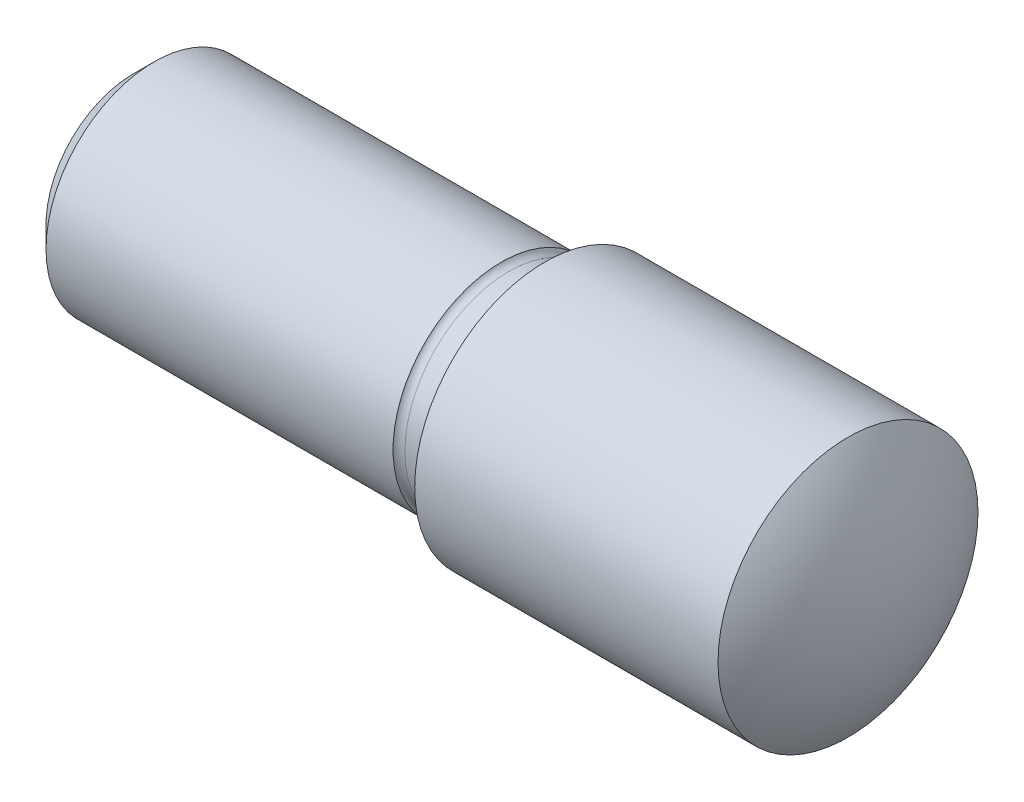
ISO-10303-21;
HEADER;
FILE_DESCRIPTION(('STEP AP214'),'2;1');
FILE_NAME('part.step','',(''),(''),'','','');
FILE_SCHEMA(('AUTOMOTIVE_DESIGN { 1 0 10303 214 1 1 1 1 }'));
ENDSEC;
DATA;
#1=APPLICATION_CONTEXT('core data for automotive mechanical design processes');
#2=APPLICATION_PROTOCOL_DEFINITION('international standard','automotive_design',2000,#1);
#3=PRODUCT_CONTEXT('',#1,'mechanical');
#4=PRODUCT('Part','Part','',(#3));
#5=PRODUCT_RELATED_PRODUCT_CATEGORY('part','',(#4));
#6=PRODUCT_DEFINITION_FORMATION('','',#4);
#7=PRODUCT_DEFINITION_CONTEXT('part definition',#1,'design');
#8=PRODUCT_DEFINITION('design','',#6,#7);
#9=PRODUCT_DEFINITION_SHAPE('','',#8);
#10=(LENGTH_UNIT() NAMED_UNIT(*) SI_UNIT(.MILLI.,.METRE.));
#11=(NAMED_UNIT(*) PLANE_ANGLE_UNIT() SI_UNIT($,.RADIAN.));
#12=(NAMED_UNIT(*) SI_UNIT($,.STERADIAN.) SOLID_ANGLE_UNIT());
#13=UNCERTAINTY_MEASURE_WITH_UNIT(LENGTH_MEASURE(1.E-05),#10,'distance_accuracy_value','');
#14=(GEOMETRIC_REPRESENTATION_CONTEXT(3) GLOBAL_UNCERTAINTY_ASSIGNED_CONTEXT((#13)) GLOBAL_UNIT_ASSIGNED_CONTEXT((#10,
#11,#12)) REPRESENTATION_CONTEXT('',''));
#15=CARTESIAN_POINT('',(0.,0.,0.));
#16=DIRECTION('',(0.,0.,1.));
#17=DIRECTION('',(1.,0.,0.));
#18=AXIS2_PLACEMENT_3D('',#15,#16,#17);
#19=CARTESIAN_POINT('',(-9.5,0.,0.));
#20=DIRECTION('',(1.,0.,0.));
#21=DIRECTION('',(0.,0.,-1.));
#22=AXIS2_PLACEMENT_3D('',#19,#20,#21);
#23=PLANE('',#22);
#24=CARTESIAN_POINT('',(-9.49999999994589,0.,0.));
#25=DIRECTION('',(1.,0.,0.));
#26=DIRECTION('',(0.,0.,-1.));
#27=AXIS2_PLACEMENT_3D('',#24,#25,#26);
#28=CIRCLE('',#27,2.00950000004241);
#29=CARTESIAN_POINT('',(-9.49999999994589,0.,-2.00950000004241));
#30=VERTEX_POINT('',#29);
#31=EDGE_CURVE('E125',#30,#30,#28,.T.);
#32=ORIENTED_EDGE('',*,*,#31,.F.);
#33=EDGE_LOOP('',(#32));
#34=FACE_BOUND('',#33,.T.);
#35=ADVANCED_FACE('F17',(#34),#23,.F.);
#36=CARTESIAN_POINT('',(-9.00950000004741,0.,0.));
#37=DIRECTION('',(1.,0.,0.));
#38=DIRECTION('',(0.,0.,-1.));
#39=AXIS2_PLACEMENT_3D('',#36,#37,#38);
#40=CONICAL_SURFACE('',#39,2.49999999988404,0.785398163339504);
#41=ORIENTED_EDGE('',*,*,#31,.T.);
#42=EDGE_LOOP('',(#41));
#43=FACE_BOUND('',#42,.T.);
#44=CARTESIAN_POINT('',(-9.0095,0.,0.));
#45=DIRECTION('',(-1.,0.,0.));
#46=DIRECTION('',(0.,0.,1.));
#47=AXIS2_PLACEMENT_3D('',#44,#45,#46);
#48=CIRCLE('',#47,2.5);
#49=CARTESIAN_POINT('',(-9.0095,0.,2.5));
#50=VERTEX_POINT('',#49);
#51=EDGE_CURVE('E126',#50,#50,#48,.F.);
#52=ORIENTED_EDGE('',*,*,#51,.F.);
#53=EDGE_LOOP('',(#52));
#54=FACE_BOUND('',#53,.T.);
#55=ADVANCED_FACE('F100',(#43,#54),#40,.T.);
#56=CARTESIAN_POINT('',(0.,0.,0.));
#57=DIRECTION('',(-1.,0.,0.));
#58=DIRECTION('',(0.,0.,1.));
#59=AXIS2_PLACEMENT_3D('',#56,#57,#58);
#60=CYLINDRICAL_SURFACE('',#59,2.5);
#61=CARTESIAN_POINT('',(-1.,0.,0.));
#62=DIRECTION('',(1.,0.,0.));
#63=DIRECTION('',(0.,0.,-1.));
#64=AXIS2_PLACEMENT_3D('',#61,#62,#63);
#65=CIRCLE('',#64,2.5);
#66=CARTESIAN_POINT('',(-1.,0.,-2.5));
#67=VERTEX_POINT('',#66);
#68=EDGE_CURVE('E129',#67,#67,#65,.F.);
#69=ORIENTED_EDGE('',*,*,#68,.T.);
#70=EDGE_LOOP('',(#69));
#71=FACE_BOUND('',#70,.T.);
#72=ORIENTED_EDGE('',*,*,#51,.T.);
#73=EDGE_LOOP('',(#72));
#74=FACE_BOUND('',#73,.T.);
#75=ADVANCED_FACE('F97',(#71,#74),#60,.T.);
#76=CARTESIAN_POINT('',(-0.826794919243111,0.,0.));
#77=DIRECTION('',(1.,0.,0.));
#78=DIRECTION('',(0.,0.,-1.));
#79=AXIS2_PLACEMENT_3D('',#76,#77,#78);
#80=TOROIDAL_SURFACE('',#79,2.6,0.200000000000002);
#81=CARTESIAN_POINT('',(-0.826794919243111,0.,0.));
#82=DIRECTION('',(-1.,0.,0.));
#83=DIRECTION('',(0.,0.,1.));
#84=AXIS2_PLACEMENT_3D('',#81,#82,#83);
#85=CIRCLE('',#84,2.4);
#86=CARTESIAN_POINT('',(-0.826794919243111,0.,2.4));
#87=VERTEX_POINT('',#86);
#88=EDGE_CURVE('E90',#87,#87,#85,.F.);
#89=ORIENTED_EDGE('',*,*,#88,.F.);
#90=EDGE_LOOP('',(#89));
#91=FACE_BOUND('',#90,.T.);
#92=ORIENTED_EDGE('',*,*,#68,.F.);
#93=EDGE_LOOP('',(#92));
#94=FACE_BOUND('',#93,.T.);
#95=ADVANCED_FACE('F94',(#91,#94),#80,.F.);
#96=CARTESIAN_POINT('',(50.,0.,0.));
#97=DIRECTION('',(-1.,0.,0.));
#98=DIRECTION('',(0.,0.,1.));
#99=AXIS2_PLACEMENT_3D('',#96,#97,#98);
#100=CYLINDRICAL_SURFACE('',#99,2.4);
#101=CARTESIAN_POINT('',(-0.200000000000003,0.,0.));
#102=DIRECTION('',(1.,0.,0.));
#103=DIRECTION('',(0.,0.,-1.));
#104=AXIS2_PLACEMENT_3D('',#101,#102,#103);
#105=CIRCLE('',#104,2.4);
#106=CARTESIAN_POINT('',(-0.200000000000003,0.,-2.4));
#107=VERTEX_POINT('',#106);
#108=EDGE_CURVE('E45',#107,#107,#105,.F.);
#109=ORIENTED_EDGE('',*,*,#108,.T.);
#110=EDGE_LOOP('',(#109));
#111=FACE_BOUND('',#110,.T.);
#112=ORIENTED_EDGE('',*,*,#88,.T.);
#113=EDGE_LOOP('',(#112));
#114=FACE_BOUND('',#113,.T.);
#115=ADVANCED_FACE('F76',(#111,#114),#100,.T.);
#116=CARTESIAN_POINT('',(-0.200000000000001,0.,0.));
#117=DIRECTION('',(1.,0.,0.));
#118=DIRECTION('',(0.,0.,-1.));
#119=AXIS2_PLACEMENT_3D('',#116,#117,#118);
#120=TOROIDAL_SURFACE('',#119,2.6,0.200000000000001);
#121=ORIENTED_EDGE('',*,*,#108,.F.);
#122=EDGE_LOOP('',(#121));
#123=FACE_BOUND('',#122,.T.);
#124=CARTESIAN_POINT('',(0.,0.,0.));
#125=DIRECTION('',(-1.,0.,0.));
#126=DIRECTION('',(0.,0.,-1.));
#127=AXIS2_PLACEMENT_3D('',#124,#125,#126);
#128=CIRCLE('',#127,2.6);
#129=CARTESIAN_POINT('',(0.,0.,-2.6));
#130=VERTEX_POINT('',#129);
#131=CARTESIAN_POINT('',(0.,0.,2.6));
#132=VERTEX_POINT('',#131);
#133=EDGE_CURVE('E36',#130,#132,#128,.T.);
#134=ORIENTED_EDGE('',*,*,#133,.T.);
#135=CARTESIAN_POINT('',(0.,0.,0.));
#136=DIRECTION('',(-1.,0.,0.));
#137=DIRECTION('',(0.,0.,1.));
#138=AXIS2_PLACEMENT_3D('',#135,#136,#137);
#139=CIRCLE('',#138,2.6);
#140=EDGE_CURVE('E34',#132,#130,#139,.T.);
#141=ORIENTED_EDGE('',*,*,#140,.T.);
#142=EDGE_LOOP('',(#134,#141));
#143=FACE_BOUND('',#142,.T.);
#144=ADVANCED_FACE('F38',(#123,#143),#120,.F.);
#145=CARTESIAN_POINT('',(0.,2.6,0.));
#146=DIRECTION('',(1.,0.,0.));
#147=DIRECTION('',(0.,0.,-1.));
#148=AXIS2_PLACEMENT_3D('',#145,#146,#147);
#149=PLANE('',#148);
#150=CARTESIAN_POINT('',(0.,0.,0.));
#151=DIRECTION('',(-1.,0.,0.));
#152=DIRECTION('',(0.,0.,1.));
#153=AXIS2_PLACEMENT_3D('',#150,#151,#152);
#154=CIRCLE('',#153,3.);
#155=CARTESIAN_POINT('',(0.,0.,3.));
#156=VERTEX_POINT('',#155);
#157=EDGE_CURVE('E27',#156,#156,#154,.F.);
#158=ORIENTED_EDGE('',*,*,#157,.F.);
#159=EDGE_LOOP('',(#158));
#160=FACE_BOUND('',#159,.T.);
#161=ORIENTED_EDGE('',*,*,#140,.F.);
#162=ORIENTED_EDGE('',*,*,#133,.F.);
#163=EDGE_LOOP('',(#161,#162));
#164=FACE_BOUND('',#163,.T.);
#165=ADVANCED_FACE('F44',(#160,#164),#149,.F.);
#166=CARTESIAN_POINT('',(2.99999999999999,0.,0.));
#167=DIRECTION('',(0.,-1.,0.));
#168=DIRECTION('',(0.,0.,-1.));
#169=AXIS2_PLACEMENT_3D('',#166,#167,#168);
#170=SPHERICAL_SURFACE('',#169,5.00000000000001);
#171=CARTESIAN_POINT('',(7.,0.,0.));
#172=DIRECTION('',(-1.,0.,0.));
#173=DIRECTION('',(0.,0.,1.));
#174=AXIS2_PLACEMENT_3D('',#171,#172,#173);
#175=CIRCLE('',#174,3.);
#176=CARTESIAN_POINT('',(7.,0.,3.));
#177=VERTEX_POINT('',#176);
#178=EDGE_CURVE('E11',#177,#177,#175,.T.);
#179=ORIENTED_EDGE('',*,*,#178,.F.);
#180=EDGE_LOOP('',(#179));
#181=FACE_BOUND('',#180,.T.);
#182=ADVANCED_FACE('F61',(#181),#170,.T.);
#183=CARTESIAN_POINT('',(6.,0.,0.));
#184=DIRECTION('',(-1.,0.,0.));
#185=DIRECTION('',(0.,0.,1.));
#186=AXIS2_PLACEMENT_3D('',#183,#184,#185);
#187=CYLINDRICAL_SURFACE('',#186,3.);
#188=ORIENTED_EDGE('',*,*,#178,.T.);
#189=EDGE_LOOP('',(#188));
#190=FACE_BOUND('',#189,.T.);
#191=ORIENTED_EDGE('',*,*,#157,.T.);
#192=EDGE_LOOP('',(#191));
#193=FACE_BOUND('',#192,.T.);
#194=ADVANCED_FACE('F111',(#190,#193),#187,.T.);
#195=CLOSED_SHELL('',(#35,#55,#75,#95,#115,#144,#165,#182,#194));
#196=MANIFOLD_SOLID_BREP('B1',#195);
#197=ADVANCED_BREP_SHAPE_REPRESENTATION('',(#18,#196),#14);
#198=SHAPE_DEFINITION_REPRESENTATION(#9,#197);
ENDSEC;
END-ISO-10303-21;
